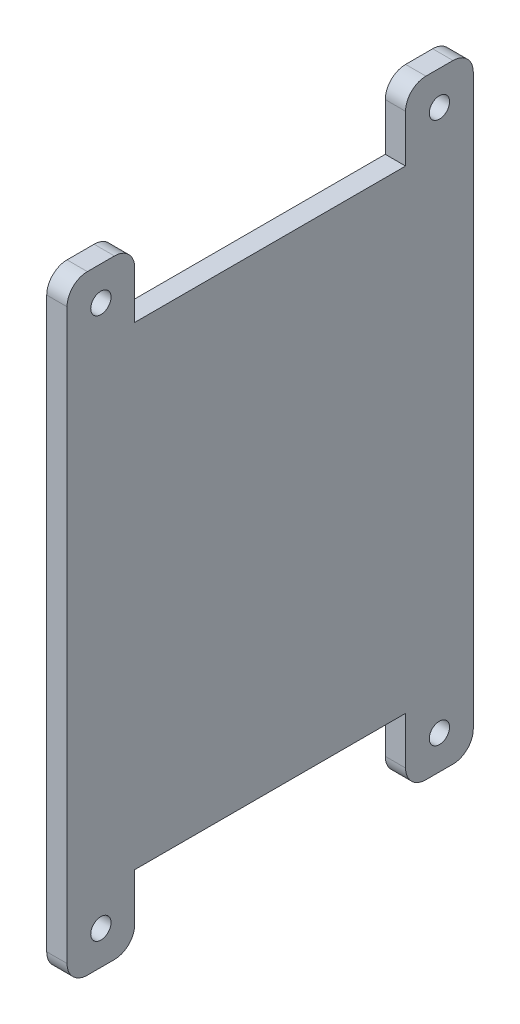
ISO-10303-21;
HEADER;
FILE_DESCRIPTION(('STEP AP214'),'2;1');
FILE_NAME('part.step','',(''),(''),'','','');
FILE_SCHEMA(('AUTOMOTIVE_DESIGN { 1 0 10303 214 1 1 1 1 }'));
ENDSEC;
DATA;
#1=APPLICATION_CONTEXT('core data for automotive mechanical design processes');
#2=APPLICATION_PROTOCOL_DEFINITION('international standard','automotive_design',2000,#1);
#3=PRODUCT_CONTEXT('',#1,'mechanical');
#4=PRODUCT('Part','Part','',(#3));
#5=PRODUCT_RELATED_PRODUCT_CATEGORY('part','',(#4));
#6=PRODUCT_DEFINITION_FORMATION('','',#4);
#7=PRODUCT_DEFINITION_CONTEXT('part definition',#1,'design');
#8=PRODUCT_DEFINITION('design','',#6,#7);
#9=PRODUCT_DEFINITION_SHAPE('','',#8);
#10=(LENGTH_UNIT() NAMED_UNIT(*) SI_UNIT(.MILLI.,.METRE.));
#11=(NAMED_UNIT(*) PLANE_ANGLE_UNIT() SI_UNIT($,.RADIAN.));
#12=(NAMED_UNIT(*) SI_UNIT($,.STERADIAN.) SOLID_ANGLE_UNIT());
#13=UNCERTAINTY_MEASURE_WITH_UNIT(LENGTH_MEASURE(1.E-05),#10,'distance_accuracy_value','');
#14=(GEOMETRIC_REPRESENTATION_CONTEXT(3) GLOBAL_UNCERTAINTY_ASSIGNED_CONTEXT((#13)) GLOBAL_UNIT_ASSIGNED_CONTEXT((#10,
#11,#12)) REPRESENTATION_CONTEXT('',''));
#15=CARTESIAN_POINT('',(0.,0.,0.));
#16=DIRECTION('',(0.,0.,1.));
#17=DIRECTION('',(1.,0.,0.));
#18=AXIS2_PLACEMENT_3D('',#15,#16,#17);
#19=CARTESIAN_POINT('',(3.,-47.3999085346622,11.8635274080616));
#20=DIRECTION('',(0.,0.,-1.));
#21=DIRECTION('',(-1.,0.,0.));
#22=AXIS2_PLACEMENT_3D('',#19,#20,#21);
#23=PLANE('',#22);
#24=DIRECTION('',(0.,-1.,0.));
#25=VECTOR('',#24,1.);
#26=CARTESIAN_POINT('',(0.,-47.3999085346622,11.8635274080616));
#27=LINE('',#26,#25);
#28=CARTESIAN_POINT('',(0.,29.6000914653378,11.8635274080616));
#29=VERTEX_POINT('',#28);
#30=CARTESIAN_POINT('',(0.,-54.3999085346622,11.8635274080616));
#31=VERTEX_POINT('',#30);
#32=EDGE_CURVE('E120',#29,#31,#27,.T.);
#33=ORIENTED_EDGE('',*,*,#32,.T.);
#34=DIRECTION('',(-1.,0.,0.));
#35=VECTOR('',#34,1.);
#36=CARTESIAN_POINT('',(3.,-54.3999085346622,11.8635274080616));
#37=LINE('',#36,#35);
#38=CARTESIAN_POINT('',(3.,-54.3999085346622,11.8635274080616));
#39=VERTEX_POINT('',#38);
#40=EDGE_CURVE('E11',#39,#31,#37,.T.);
#41=ORIENTED_EDGE('',*,*,#40,.F.);
#42=DIRECTION('',(0.,-1.,0.));
#43=VECTOR('',#42,1.);
#44=CARTESIAN_POINT('',(3.,22.6000914653378,11.8635274080616));
#45=LINE('',#44,#43);
#46=CARTESIAN_POINT('',(3.,29.6000914653378,11.8635274080616));
#47=VERTEX_POINT('',#46);
#48=EDGE_CURVE('E126',#47,#39,#45,.T.);
#49=ORIENTED_EDGE('',*,*,#48,.F.);
#50=DIRECTION('',(-1.,0.,0.));
#51=VECTOR('',#50,1.);
#52=CARTESIAN_POINT('',(3.,29.6000914653378,11.8635274080616));
#53=LINE('',#52,#51);
#54=EDGE_CURVE('E196',#47,#29,#53,.T.);
#55=ORIENTED_EDGE('',*,*,#54,.T.);
#56=EDGE_LOOP('',(#33,#41,#49,#55));
#57=FACE_BOUND('',#56,.T.);
#58=ADVANCED_FACE('F32',(#57),#23,.F.);
#59=CARTESIAN_POINT('',(3.,-54.3999085346622,8.86352740806162));
#60=DIRECTION('',(-1.,0.,0.));
#61=DIRECTION('',(0.,0.,1.));
#62=AXIS2_PLACEMENT_3D('',#59,#60,#61);
#63=CYLINDRICAL_SURFACE('',#62,3.);
#64=CARTESIAN_POINT('',(0.,-54.3999085346622,8.86352740806162));
#65=DIRECTION('',(1.,0.,0.));
#66=DIRECTION('',(0.,0.,-1.));
#67=AXIS2_PLACEMENT_3D('',#64,#65,#66);
#68=CIRCLE('',#67,3.);
#69=CARTESIAN_POINT('',(0.,-57.3999085346622,8.8635274080616));
#70=VERTEX_POINT('',#69);
#71=EDGE_CURVE('E201',#31,#70,#68,.T.);
#72=ORIENTED_EDGE('',*,*,#71,.T.);
#73=DIRECTION('',(-1.,0.,0.));
#74=VECTOR('',#73,1.);
#75=CARTESIAN_POINT('',(3.,-57.3999085346622,8.8635274080616));
#76=LINE('',#75,#74);
#77=CARTESIAN_POINT('',(3.,-57.3999085346622,8.8635274080616));
#78=VERTEX_POINT('',#77);
#79=EDGE_CURVE('E40',#78,#70,#76,.T.);
#80=ORIENTED_EDGE('',*,*,#79,.F.);
#81=CARTESIAN_POINT('',(3.,-54.3999085346622,8.86352740806162));
#82=DIRECTION('',(1.,0.,0.));
#83=DIRECTION('',(0.,0.,-1.));
#84=AXIS2_PLACEMENT_3D('',#81,#82,#83);
#85=CIRCLE('',#84,3.);
#86=EDGE_CURVE('E347',#39,#78,#85,.T.);
#87=ORIENTED_EDGE('',*,*,#86,.F.);
#88=ORIENTED_EDGE('',*,*,#40,.T.);
#89=EDGE_LOOP('',(#72,#80,#87,#88));
#90=FACE_BOUND('',#89,.T.);
#91=ADVANCED_FACE('F353',(#90),#63,.T.);
#92=CARTESIAN_POINT('',(3.,-57.3999085346622,8.8635274080616));
#93=DIRECTION('',(0.,1.,0.));
#94=DIRECTION('',(0.,0.,1.));
#95=AXIS2_PLACEMENT_3D('',#92,#93,#94);
#96=PLANE('',#95);
#97=DIRECTION('',(0.,0.,-1.));
#98=VECTOR('',#97,1.);
#99=CARTESIAN_POINT('',(0.,-57.3999085346622,8.8635274080616));
#100=LINE('',#99,#98);
#101=CARTESIAN_POINT('',(0.,-57.3999085346622,4.86352740806164));
#102=VERTEX_POINT('',#101);
#103=EDGE_CURVE('E204',#70,#102,#100,.T.);
#104=ORIENTED_EDGE('',*,*,#103,.T.);
#105=DIRECTION('',(-1.,0.,0.));
#106=VECTOR('',#105,1.);
#107=CARTESIAN_POINT('',(3.,-57.3999085346622,4.86352740806164));
#108=LINE('',#107,#106);
#109=CARTESIAN_POINT('',(3.,-57.3999085346622,4.86352740806164));
#110=VERTEX_POINT('',#109);
#111=EDGE_CURVE('E282',#110,#102,#108,.T.);
#112=ORIENTED_EDGE('',*,*,#111,.F.);
#113=DIRECTION('',(0.,0.,-1.));
#114=VECTOR('',#113,1.);
#115=CARTESIAN_POINT('',(3.,-57.3999085346622,8.8635274080616));
#116=LINE('',#115,#114);
#117=EDGE_CURVE('E291',#78,#110,#116,.T.);
#118=ORIENTED_EDGE('',*,*,#117,.F.);
#119=ORIENTED_EDGE('',*,*,#79,.T.);
#120=EDGE_LOOP('',(#104,#112,#118,#119));
#121=FACE_BOUND('',#120,.T.);
#122=ADVANCED_FACE('F289',(#121),#96,.F.);
#123=CARTESIAN_POINT('',(3.,-54.3999085346622,4.86352740806162));
#124=DIRECTION('',(-1.,0.,0.));
#125=DIRECTION('',(0.,0.,1.));
#126=AXIS2_PLACEMENT_3D('',#123,#124,#125);
#127=CYLINDRICAL_SURFACE('',#126,3.);
#128=CARTESIAN_POINT('',(0.,-54.3999085346622,4.86352740806162));
#129=DIRECTION('',(1.,0.,0.));
#130=DIRECTION('',(0.,0.,-1.));
#131=AXIS2_PLACEMENT_3D('',#128,#129,#130);
#132=CIRCLE('',#131,3.);
#133=CARTESIAN_POINT('',(0.,-54.3999085346622,1.86352740806162));
#134=VERTEX_POINT('',#133);
#135=EDGE_CURVE('E206',#102,#134,#132,.T.);
#136=ORIENTED_EDGE('',*,*,#135,.T.);
#137=DIRECTION('',(-1.,0.,0.));
#138=VECTOR('',#137,1.);
#139=CARTESIAN_POINT('',(3.,-54.3999085346622,1.86352740806162));
#140=LINE('',#139,#138);
#141=CARTESIAN_POINT('',(3.,-54.3999085346622,1.86352740806162));
#142=VERTEX_POINT('',#141);
#143=EDGE_CURVE('E279',#142,#134,#140,.T.);
#144=ORIENTED_EDGE('',*,*,#143,.F.);
#145=CARTESIAN_POINT('',(3.,-54.3999085346622,4.86352740806162));
#146=DIRECTION('',(1.,0.,0.));
#147=DIRECTION('',(0.,0.,-1.));
#148=AXIS2_PLACEMENT_3D('',#145,#146,#147);
#149=CIRCLE('',#148,3.);
#150=EDGE_CURVE('E309',#110,#142,#149,.T.);
#151=ORIENTED_EDGE('',*,*,#150,.F.);
#152=ORIENTED_EDGE('',*,*,#111,.T.);
#153=EDGE_LOOP('',(#136,#144,#151,#152));
#154=FACE_BOUND('',#153,.T.);
#155=ADVANCED_FACE('F300',(#154),#127,.T.);
#156=CARTESIAN_POINT('',(3.,-47.3999085346622,1.86352740806162));
#157=DIRECTION('',(0.,0.,1.));
#158=DIRECTION('',(0.,-1.,0.));
#159=AXIS2_PLACEMENT_3D('',#156,#157,#158);
#160=PLANE('',#159);
#161=DIRECTION('',(0.,1.,0.));
#162=VECTOR('',#161,1.);
#163=CARTESIAN_POINT('',(0.,-47.3999085346622,1.86352740806162));
#164=LINE('',#163,#162);
#165=CARTESIAN_POINT('',(0.,-47.3999085346622,1.86352740806162));
#166=VERTEX_POINT('',#165);
#167=EDGE_CURVE('E208',#134,#166,#164,.T.);
#168=ORIENTED_EDGE('',*,*,#167,.T.);
#169=DIRECTION('',(-1.,0.,0.));
#170=VECTOR('',#169,1.);
#171=CARTESIAN_POINT('',(3.,-47.3999085346622,1.86352740806162));
#172=LINE('',#171,#170);
#173=CARTESIAN_POINT('',(3.,-47.3999085346622,1.86352740806162));
#174=VERTEX_POINT('',#173);
#175=EDGE_CURVE('E276',#174,#166,#172,.T.);
#176=ORIENTED_EDGE('',*,*,#175,.F.);
#177=DIRECTION('',(0.,1.,0.));
#178=VECTOR('',#177,1.);
#179=CARTESIAN_POINT('',(3.,-47.3999085346622,1.86352740806162));
#180=LINE('',#179,#178);
#181=EDGE_CURVE('E306',#142,#174,#180,.T.);
#182=ORIENTED_EDGE('',*,*,#181,.F.);
#183=ORIENTED_EDGE('',*,*,#143,.T.);
#184=EDGE_LOOP('',(#168,#176,#182,#183));
#185=FACE_BOUND('',#184,.T.);
#186=ADVANCED_FACE('F304',(#185),#160,.F.);
#187=CARTESIAN_POINT('',(3.,-47.3999085346622,1.86352740806162));
#188=DIRECTION('',(0.,1.,0.));
#189=DIRECTION('',(0.,0.,1.));
#190=AXIS2_PLACEMENT_3D('',#187,#188,#189);
#191=PLANE('',#190);
#192=DIRECTION('',(0.,0.,-1.));
#193=VECTOR('',#192,1.);
#194=CARTESIAN_POINT('',(0.,-47.3999085346622,1.86352740806162));
#195=LINE('',#194,#193);
#196=CARTESIAN_POINT('',(0.,-47.3999085346622,-38.1364725919384));
#197=VERTEX_POINT('',#196);
#198=EDGE_CURVE('E210',#166,#197,#195,.T.);
#199=ORIENTED_EDGE('',*,*,#198,.T.);
#200=DIRECTION('',(-1.,0.,0.));
#201=VECTOR('',#200,1.);
#202=CARTESIAN_POINT('',(3.,-47.3999085346622,-38.1364725919384));
#203=LINE('',#202,#201);
#204=CARTESIAN_POINT('',(3.,-47.3999085346622,-38.1364725919384));
#205=VERTEX_POINT('',#204);
#206=EDGE_CURVE('E273',#205,#197,#203,.T.);
#207=ORIENTED_EDGE('',*,*,#206,.F.);
#208=DIRECTION('',(0.,0.,-1.));
#209=VECTOR('',#208,1.);
#210=CARTESIAN_POINT('',(3.,-47.3999085346622,1.86352740806162));
#211=LINE('',#210,#209);
#212=EDGE_CURVE('E308',#174,#205,#211,.T.);
#213=ORIENTED_EDGE('',*,*,#212,.F.);
#214=ORIENTED_EDGE('',*,*,#175,.T.);
#215=EDGE_LOOP('',(#199,#207,#213,#214));
#216=FACE_BOUND('',#215,.T.);
#217=ADVANCED_FACE('F365',(#216),#191,.F.);
#218=CARTESIAN_POINT('',(3.,-47.3999085346622,-38.1364725919384));
#219=DIRECTION('',(0.,0.,-1.));
#220=DIRECTION('',(0.,1.,0.));
#221=AXIS2_PLACEMENT_3D('',#218,#219,#220);
#222=PLANE('',#221);
#223=DIRECTION('',(0.,-1.,0.));
#224=VECTOR('',#223,1.);
#225=CARTESIAN_POINT('',(0.,-47.3999085346622,-38.1364725919384));
#226=LINE('',#225,#224);
#227=CARTESIAN_POINT('',(0.,-54.3999085346622,-38.1364725919384));
#228=VERTEX_POINT('',#227);
#229=EDGE_CURVE('E212',#197,#228,#226,.T.);
#230=ORIENTED_EDGE('',*,*,#229,.T.);
#231=DIRECTION('',(-1.,0.,0.));
#232=VECTOR('',#231,1.);
#233=CARTESIAN_POINT('',(3.,-54.3999085346622,-38.1364725919384));
#234=LINE('',#233,#232);
#235=CARTESIAN_POINT('',(3.,-54.3999085346622,-38.1364725919384));
#236=VERTEX_POINT('',#235);
#237=EDGE_CURVE('E270',#236,#228,#234,.T.);
#238=ORIENTED_EDGE('',*,*,#237,.F.);
#239=DIRECTION('',(0.,-1.,0.));
#240=VECTOR('',#239,1.);
#241=CARTESIAN_POINT('',(3.,-47.3999085346622,-38.1364725919384));
#242=LINE('',#241,#240);
#243=EDGE_CURVE('E311',#205,#236,#242,.T.);
#244=ORIENTED_EDGE('',*,*,#243,.F.);
#245=ORIENTED_EDGE('',*,*,#206,.T.);
#246=EDGE_LOOP('',(#230,#238,#244,#245));
#247=FACE_BOUND('',#246,.T.);
#248=ADVANCED_FACE('F368',(#247),#222,.F.);
#249=CARTESIAN_POINT('',(3.,-54.3999085346622,-41.1364725919384));
#250=DIRECTION('',(-1.,0.,0.));
#251=DIRECTION('',(0.,0.,1.));
#252=AXIS2_PLACEMENT_3D('',#249,#250,#251);
#253=CYLINDRICAL_SURFACE('',#252,3.);
#254=CARTESIAN_POINT('',(0.,-54.3999085346622,-41.1364725919384));
#255=DIRECTION('',(1.,0.,0.));
#256=DIRECTION('',(0.,0.,1.));
#257=AXIS2_PLACEMENT_3D('',#254,#255,#256);
#258=CIRCLE('',#257,3.);
#259=CARTESIAN_POINT('',(0.,-57.3999085346622,-41.1364725919384));
#260=VERTEX_POINT('',#259);
#261=EDGE_CURVE('E214',#228,#260,#258,.T.);
#262=ORIENTED_EDGE('',*,*,#261,.T.);
#263=DIRECTION('',(-1.,0.,0.));
#264=VECTOR('',#263,1.);
#265=CARTESIAN_POINT('',(3.,-57.3999085346622,-41.1364725919384));
#266=LINE('',#265,#264);
#267=CARTESIAN_POINT('',(3.,-57.3999085346622,-41.1364725919384));
#268=VERTEX_POINT('',#267);
#269=EDGE_CURVE('E267',#268,#260,#266,.T.);
#270=ORIENTED_EDGE('',*,*,#269,.F.);
#271=CARTESIAN_POINT('',(3.,-54.3999085346622,-41.1364725919384));
#272=DIRECTION('',(1.,0.,0.));
#273=DIRECTION('',(0.,0.,1.));
#274=AXIS2_PLACEMENT_3D('',#271,#272,#273);
#275=CIRCLE('',#274,3.);
#276=EDGE_CURVE('E317',#236,#268,#275,.T.);
#277=ORIENTED_EDGE('',*,*,#276,.F.);
#278=ORIENTED_EDGE('',*,*,#237,.T.);
#279=EDGE_LOOP('',(#262,#270,#277,#278));
#280=FACE_BOUND('',#279,.T.);
#281=ADVANCED_FACE('F372',(#280),#253,.T.);
#282=CARTESIAN_POINT('',(3.,-57.3999085346622,-45.1364725919384));
#283=DIRECTION('',(0.,1.,0.));
#284=DIRECTION('',(0.,0.,1.));
#285=AXIS2_PLACEMENT_3D('',#282,#283,#284);
#286=PLANE('',#285);
#287=DIRECTION('',(0.,0.,-1.));
#288=VECTOR('',#287,1.);
#289=CARTESIAN_POINT('',(0.,-57.3999085346622,-45.1364725919384));
#290=LINE('',#289,#288);
#291=CARTESIAN_POINT('',(0.,-57.3999085346622,-45.1364725919384));
#292=VERTEX_POINT('',#291);
#293=EDGE_CURVE('E216',#260,#292,#290,.T.);
#294=ORIENTED_EDGE('',*,*,#293,.T.);
#295=DIRECTION('',(-1.,0.,0.));
#296=VECTOR('',#295,1.);
#297=CARTESIAN_POINT('',(3.,-57.3999085346622,-45.1364725919384));
#298=LINE('',#297,#296);
#299=CARTESIAN_POINT('',(3.,-57.3999085346622,-45.1364725919384));
#300=VERTEX_POINT('',#299);
#301=EDGE_CURVE('E264',#300,#292,#298,.T.);
#302=ORIENTED_EDGE('',*,*,#301,.F.);
#303=DIRECTION('',(0.,0.,-1.));
#304=VECTOR('',#303,1.);
#305=CARTESIAN_POINT('',(3.,-57.3999085346622,-45.1364725919384));
#306=LINE('',#305,#304);
#307=EDGE_CURVE('E319',#268,#300,#306,.T.);
#308=ORIENTED_EDGE('',*,*,#307,.F.);
#309=ORIENTED_EDGE('',*,*,#269,.T.);
#310=EDGE_LOOP('',(#294,#302,#308,#309));
#311=FACE_BOUND('',#310,.T.);
#312=ADVANCED_FACE('F376',(#311),#286,.F.);
#313=CARTESIAN_POINT('',(3.,-54.3999085346622,-45.1364725919384));
#314=DIRECTION('',(-1.,0.,0.));
#315=DIRECTION('',(0.,0.,1.));
#316=AXIS2_PLACEMENT_3D('',#313,#314,#315);
#317=CYLINDRICAL_SURFACE('',#316,3.);
#318=CARTESIAN_POINT('',(0.,-54.3999085346622,-45.1364725919384));
#319=DIRECTION('',(1.,0.,0.));
#320=DIRECTION('',(0.,0.,1.));
#321=AXIS2_PLACEMENT_3D('',#318,#319,#320);
#322=CIRCLE('',#321,3.);
#323=CARTESIAN_POINT('',(0.,-54.3999085346622,-48.1364725919384));
#324=VERTEX_POINT('',#323);
#325=EDGE_CURVE('E218',#292,#324,#322,.T.);
#326=ORIENTED_EDGE('',*,*,#325,.T.);
#327=DIRECTION('',(-1.,0.,0.));
#328=VECTOR('',#327,1.);
#329=CARTESIAN_POINT('',(3.,-54.3999085346622,-48.1364725919384));
#330=LINE('',#329,#328);
#331=CARTESIAN_POINT('',(3.,-54.3999085346622,-48.1364725919384));
#332=VERTEX_POINT('',#331);
#333=EDGE_CURVE('E261',#332,#324,#330,.T.);
#334=ORIENTED_EDGE('',*,*,#333,.F.);
#335=CARTESIAN_POINT('',(3.,-54.3999085346622,-45.1364725919384));
#336=DIRECTION('',(1.,0.,0.));
#337=DIRECTION('',(0.,0.,1.));
#338=AXIS2_PLACEMENT_3D('',#335,#336,#337);
#339=CIRCLE('',#338,3.);
#340=EDGE_CURVE('E321',#300,#332,#339,.T.);
#341=ORIENTED_EDGE('',*,*,#340,.F.);
#342=ORIENTED_EDGE('',*,*,#301,.T.);
#343=EDGE_LOOP('',(#326,#334,#341,#342));
#344=FACE_BOUND('',#343,.T.);
#345=ADVANCED_FACE('F380',(#344),#317,.T.);
#346=CARTESIAN_POINT('',(3.,22.6000914653378,-48.1364725919384));
#347=DIRECTION('',(0.,0.,1.));
#348=DIRECTION('',(1.,0.,0.));
#349=AXIS2_PLACEMENT_3D('',#346,#347,#348);
#350=PLANE('',#349);
#351=DIRECTION('',(0.,1.,0.));
#352=VECTOR('',#351,1.);
#353=CARTESIAN_POINT('',(0.,22.6000914653378,-48.1364725919384));
#354=LINE('',#353,#352);
#355=CARTESIAN_POINT('',(0.,29.6000914653378,-48.1364725919384));
#356=VERTEX_POINT('',#355);
#357=EDGE_CURVE('E221',#324,#356,#354,.T.);
#358=ORIENTED_EDGE('',*,*,#357,.T.);
#359=DIRECTION('',(-1.,0.,0.));
#360=VECTOR('',#359,1.);
#361=CARTESIAN_POINT('',(3.,29.6000914653378,-48.1364725919384));
#362=LINE('',#361,#360);
#363=CARTESIAN_POINT('',(3.,29.6000914653378,-48.1364725919384));
#364=VERTEX_POINT('',#363);
#365=EDGE_CURVE('E258',#364,#356,#362,.T.);
#366=ORIENTED_EDGE('',*,*,#365,.F.);
#367=DIRECTION('',(0.,1.,0.));
#368=VECTOR('',#367,1.);
#369=CARTESIAN_POINT('',(3.,-47.3999085346622,-48.1364725919384));
#370=LINE('',#369,#368);
#371=EDGE_CURVE('E323',#332,#364,#370,.T.);
#372=ORIENTED_EDGE('',*,*,#371,.F.);
#373=ORIENTED_EDGE('',*,*,#333,.T.);
#374=EDGE_LOOP('',(#358,#366,#372,#373));
#375=FACE_BOUND('',#374,.T.);
#376=ADVANCED_FACE('F384',(#375),#350,.F.);
#377=CARTESIAN_POINT('',(3.,29.6000914653378,-45.1364725919384));
#378=DIRECTION('',(-1.,0.,0.));
#379=DIRECTION('',(0.,0.,1.));
#380=AXIS2_PLACEMENT_3D('',#377,#378,#379);
#381=CYLINDRICAL_SURFACE('',#380,3.);
#382=CARTESIAN_POINT('',(0.,29.6000914653378,-45.1364725919384));
#383=DIRECTION('',(1.,0.,0.));
#384=DIRECTION('',(0.,0.,-1.));
#385=AXIS2_PLACEMENT_3D('',#382,#383,#384);
#386=CIRCLE('',#385,3.);
#387=CARTESIAN_POINT('',(0.,32.6000914653378,-45.1364725919383));
#388=VERTEX_POINT('',#387);
#389=EDGE_CURVE('E223',#356,#388,#386,.T.);
#390=ORIENTED_EDGE('',*,*,#389,.T.);
#391=DIRECTION('',(-1.,0.,0.));
#392=VECTOR('',#391,1.);
#393=CARTESIAN_POINT('',(3.,32.6000914653378,-45.1364725919383));
#394=LINE('',#393,#392);
#395=CARTESIAN_POINT('',(3.,32.6000914653378,-45.1364725919383));
#396=VERTEX_POINT('',#395);
#397=EDGE_CURVE('E255',#396,#388,#394,.T.);
#398=ORIENTED_EDGE('',*,*,#397,.F.);
#399=CARTESIAN_POINT('',(3.,29.6000914653378,-45.1364725919384));
#400=DIRECTION('',(1.,0.,0.));
#401=DIRECTION('',(0.,0.,-1.));
#402=AXIS2_PLACEMENT_3D('',#399,#400,#401);
#403=CIRCLE('',#402,3.);
#404=EDGE_CURVE('E325',#364,#396,#403,.T.);
#405=ORIENTED_EDGE('',*,*,#404,.F.);
#406=ORIENTED_EDGE('',*,*,#365,.T.);
#407=EDGE_LOOP('',(#390,#398,#405,#406));
#408=FACE_BOUND('',#407,.T.);
#409=ADVANCED_FACE('F388',(#408),#381,.T.);
#410=CARTESIAN_POINT('',(3.,32.6000914653378,-45.1364725919383));
#411=DIRECTION('',(0.,-1.,0.));
#412=DIRECTION('',(0.,0.,-1.));
#413=AXIS2_PLACEMENT_3D('',#410,#411,#412);
#414=PLANE('',#413);
#415=DIRECTION('',(0.,0.,1.));
#416=VECTOR('',#415,1.);
#417=CARTESIAN_POINT('',(0.,32.6000914653378,-45.1364725919383));
#418=LINE('',#417,#416);
#419=CARTESIAN_POINT('',(0.,32.6000914653378,-41.1364725919384));
#420=VERTEX_POINT('',#419);
#421=EDGE_CURVE('E225',#388,#420,#418,.T.);
#422=ORIENTED_EDGE('',*,*,#421,.T.);
#423=DIRECTION('',(-1.,0.,0.));
#424=VECTOR('',#423,1.);
#425=CARTESIAN_POINT('',(3.,32.6000914653378,-41.1364725919384));
#426=LINE('',#425,#424);
#427=CARTESIAN_POINT('',(3.,32.6000914653378,-41.1364725919384));
#428=VERTEX_POINT('',#427);
#429=EDGE_CURVE('E252',#428,#420,#426,.T.);
#430=ORIENTED_EDGE('',*,*,#429,.F.);
#431=DIRECTION('',(0.,0.,1.));
#432=VECTOR('',#431,1.);
#433=CARTESIAN_POINT('',(3.,32.6000914653378,-45.1364725919383));
#434=LINE('',#433,#432);
#435=EDGE_CURVE('E327',#396,#428,#434,.T.);
#436=ORIENTED_EDGE('',*,*,#435,.F.);
#437=ORIENTED_EDGE('',*,*,#397,.T.);
#438=EDGE_LOOP('',(#422,#430,#436,#437));
#439=FACE_BOUND('',#438,.T.);
#440=ADVANCED_FACE('F392',(#439),#414,.F.);
#441=CARTESIAN_POINT('',(3.,29.6000914653378,-41.1364725919384));
#442=DIRECTION('',(-1.,0.,0.));
#443=DIRECTION('',(0.,0.,1.));
#444=AXIS2_PLACEMENT_3D('',#441,#442,#443);
#445=CYLINDRICAL_SURFACE('',#444,3.);
#446=CARTESIAN_POINT('',(0.,29.6000914653378,-41.1364725919384));
#447=DIRECTION('',(1.,0.,0.));
#448=DIRECTION('',(0.,0.,-1.));
#449=AXIS2_PLACEMENT_3D('',#446,#447,#448);
#450=CIRCLE('',#449,3.);
#451=CARTESIAN_POINT('',(0.,29.6000914653378,-38.1364725919384));
#452=VERTEX_POINT('',#451);
#453=EDGE_CURVE('E227',#420,#452,#450,.T.);
#454=ORIENTED_EDGE('',*,*,#453,.T.);
#455=DIRECTION('',(-1.,0.,0.));
#456=VECTOR('',#455,1.);
#457=CARTESIAN_POINT('',(3.,29.6000914653378,-38.1364725919384));
#458=LINE('',#457,#456);
#459=CARTESIAN_POINT('',(3.,29.6000914653378,-38.1364725919384));
#460=VERTEX_POINT('',#459);
#461=EDGE_CURVE('E249',#460,#452,#458,.T.);
#462=ORIENTED_EDGE('',*,*,#461,.F.);
#463=CARTESIAN_POINT('',(3.,29.6000914653378,-41.1364725919384));
#464=DIRECTION('',(1.,0.,0.));
#465=DIRECTION('',(0.,0.,-1.));
#466=AXIS2_PLACEMENT_3D('',#463,#464,#465);
#467=CIRCLE('',#466,3.);
#468=EDGE_CURVE('E329',#428,#460,#467,.T.);
#469=ORIENTED_EDGE('',*,*,#468,.F.);
#470=ORIENTED_EDGE('',*,*,#429,.T.);
#471=EDGE_LOOP('',(#454,#462,#469,#470));
#472=FACE_BOUND('',#471,.T.);
#473=ADVANCED_FACE('F396',(#472),#445,.T.);
#474=CARTESIAN_POINT('',(3.,22.6000914653378,-38.1364725919384));
#475=DIRECTION('',(0.,0.,-1.));
#476=DIRECTION('',(-1.,0.,0.));
#477=AXIS2_PLACEMENT_3D('',#474,#475,#476);
#478=PLANE('',#477);
#479=DIRECTION('',(0.,-1.,0.));
#480=VECTOR('',#479,1.);
#481=CARTESIAN_POINT('',(0.,22.6000914653378,-38.1364725919384));
#482=LINE('',#481,#480);
#483=CARTESIAN_POINT('',(0.,22.6000914653378,-38.1364725919384));
#484=VERTEX_POINT('',#483);
#485=EDGE_CURVE('E229',#452,#484,#482,.T.);
#486=ORIENTED_EDGE('',*,*,#485,.T.);
#487=DIRECTION('',(-1.,0.,0.));
#488=VECTOR('',#487,1.);
#489=CARTESIAN_POINT('',(3.,22.6000914653378,-38.1364725919384));
#490=LINE('',#489,#488);
#491=CARTESIAN_POINT('',(3.,22.6000914653378,-38.1364725919384));
#492=VERTEX_POINT('',#491);
#493=EDGE_CURVE('E246',#492,#484,#490,.T.);
#494=ORIENTED_EDGE('',*,*,#493,.F.);
#495=DIRECTION('',(0.,-1.,0.));
#496=VECTOR('',#495,1.);
#497=CARTESIAN_POINT('',(3.,22.6000914653378,-38.1364725919384));
#498=LINE('',#497,#496);
#499=EDGE_CURVE('E331',#460,#492,#498,.T.);
#500=ORIENTED_EDGE('',*,*,#499,.F.);
#501=ORIENTED_EDGE('',*,*,#461,.T.);
#502=EDGE_LOOP('',(#486,#494,#500,#501));
#503=FACE_BOUND('',#502,.T.);
#504=ADVANCED_FACE('F400',(#503),#478,.F.);
#505=CARTESIAN_POINT('',(3.,22.6000914653378,1.86352740806163));
#506=DIRECTION('',(0.,-1.,0.));
#507=DIRECTION('',(0.,0.,-1.));
#508=AXIS2_PLACEMENT_3D('',#505,#506,#507);
#509=PLANE('',#508);
#510=DIRECTION('',(0.,0.,1.));
#511=VECTOR('',#510,1.);
#512=CARTESIAN_POINT('',(0.,22.6000914653378,1.86352740806163));
#513=LINE('',#512,#511);
#514=CARTESIAN_POINT('',(0.,22.6000914653378,1.86352740806163));
#515=VERTEX_POINT('',#514);
#516=EDGE_CURVE('E231',#484,#515,#513,.T.);
#517=ORIENTED_EDGE('',*,*,#516,.T.);
#518=DIRECTION('',(-1.,0.,0.));
#519=VECTOR('',#518,1.);
#520=CARTESIAN_POINT('',(3.,22.6000914653378,1.86352740806163));
#521=LINE('',#520,#519);
#522=CARTESIAN_POINT('',(3.,22.6000914653378,1.86352740806163));
#523=VERTEX_POINT('',#522);
#524=EDGE_CURVE('E243',#523,#515,#521,.T.);
#525=ORIENTED_EDGE('',*,*,#524,.F.);
#526=DIRECTION('',(0.,0.,1.));
#527=VECTOR('',#526,1.);
#528=CARTESIAN_POINT('',(3.,22.6000914653378,1.86352740806163));
#529=LINE('',#528,#527);
#530=EDGE_CURVE('E333',#492,#523,#529,.T.);
#531=ORIENTED_EDGE('',*,*,#530,.F.);
#532=ORIENTED_EDGE('',*,*,#493,.T.);
#533=EDGE_LOOP('',(#517,#525,#531,#532));
#534=FACE_BOUND('',#533,.T.);
#535=ADVANCED_FACE('F339',(#534),#509,.F.);
#536=CARTESIAN_POINT('',(3.,22.6000914653378,1.86352740806163));
#537=DIRECTION('',(0.,0.,1.));
#538=DIRECTION('',(0.,-1.,0.));
#539=AXIS2_PLACEMENT_3D('',#536,#537,#538);
#540=PLANE('',#539);
#541=DIRECTION('',(0.,1.,0.));
#542=VECTOR('',#541,1.);
#543=CARTESIAN_POINT('',(0.,22.6000914653378,1.86352740806163));
#544=LINE('',#543,#542);
#545=CARTESIAN_POINT('',(0.,29.6000914653378,1.86352740806163));
#546=VERTEX_POINT('',#545);
#547=EDGE_CURVE('E233',#515,#546,#544,.T.);
#548=ORIENTED_EDGE('',*,*,#547,.T.);
#549=DIRECTION('',(-1.,0.,0.));
#550=VECTOR('',#549,1.);
#551=CARTESIAN_POINT('',(3.,29.6000914653378,1.86352740806163));
#552=LINE('',#551,#550);
#553=CARTESIAN_POINT('',(3.,29.6000914653378,1.86352740806163));
#554=VERTEX_POINT('',#553);
#555=EDGE_CURVE('E191',#554,#546,#552,.T.);
#556=ORIENTED_EDGE('',*,*,#555,.F.);
#557=DIRECTION('',(0.,1.,0.));
#558=VECTOR('',#557,1.);
#559=CARTESIAN_POINT('',(3.,22.6000914653378,1.86352740806163));
#560=LINE('',#559,#558);
#561=EDGE_CURVE('E182',#523,#554,#560,.T.);
#562=ORIENTED_EDGE('',*,*,#561,.F.);
#563=ORIENTED_EDGE('',*,*,#524,.T.);
#564=EDGE_LOOP('',(#548,#556,#562,#563));
#565=FACE_BOUND('',#564,.T.);
#566=ADVANCED_FACE('F343',(#565),#540,.F.);
#567=CARTESIAN_POINT('',(3.,29.6000914653378,4.86352740806163));
#568=DIRECTION('',(-1.,0.,0.));
#569=DIRECTION('',(0.,0.,1.));
#570=AXIS2_PLACEMENT_3D('',#567,#568,#569);
#571=CYLINDRICAL_SURFACE('',#570,3.);
#572=CARTESIAN_POINT('',(0.,29.6000914653378,4.86352740806163));
#573=DIRECTION('',(1.,0.,0.));
#574=DIRECTION('',(0.,0.,1.));
#575=AXIS2_PLACEMENT_3D('',#572,#573,#574);
#576=CIRCLE('',#575,3.);
#577=CARTESIAN_POINT('',(0.,32.6000914653378,4.86352740806165));
#578=VERTEX_POINT('',#577);
#579=EDGE_CURVE('E190',#546,#578,#576,.T.);
#580=ORIENTED_EDGE('',*,*,#579,.T.);
#581=DIRECTION('',(-1.,0.,0.));
#582=VECTOR('',#581,1.);
#583=CARTESIAN_POINT('',(3.,32.6000914653378,4.86352740806165));
#584=LINE('',#583,#582);
#585=CARTESIAN_POINT('',(3.,32.6000914653378,4.86352740806165));
#586=VERTEX_POINT('',#585);
#587=EDGE_CURVE('E187',#586,#578,#584,.T.);
#588=ORIENTED_EDGE('',*,*,#587,.F.);
#589=CARTESIAN_POINT('',(3.,29.6000914653378,4.86352740806163));
#590=DIRECTION('',(1.,0.,0.));
#591=DIRECTION('',(0.,0.,1.));
#592=AXIS2_PLACEMENT_3D('',#589,#590,#591);
#593=CIRCLE('',#592,3.);
#594=EDGE_CURVE('E176',#554,#586,#593,.T.);
#595=ORIENTED_EDGE('',*,*,#594,.F.);
#596=ORIENTED_EDGE('',*,*,#555,.T.);
#597=EDGE_LOOP('',(#580,#588,#595,#596));
#598=FACE_BOUND('',#597,.T.);
#599=ADVANCED_FACE('F188',(#598),#571,.T.);
#600=CARTESIAN_POINT('',(3.,32.6000914653378,8.86352740806161));
#601=DIRECTION('',(0.,-1.,0.));
#602=DIRECTION('',(0.,0.,-1.));
#603=AXIS2_PLACEMENT_3D('',#600,#601,#602);
#604=PLANE('',#603);
#605=DIRECTION('',(0.,0.,1.));
#606=VECTOR('',#605,1.);
#607=CARTESIAN_POINT('',(0.,32.6000914653378,8.86352740806161));
#608=LINE('',#607,#606);
#609=CARTESIAN_POINT('',(0.,32.6000914653378,8.86352740806161));
#610=VERTEX_POINT('',#609);
#611=EDGE_CURVE('E113',#578,#610,#608,.T.);
#612=ORIENTED_EDGE('',*,*,#611,.T.);
#613=DIRECTION('',(-1.,0.,0.));
#614=VECTOR('',#613,1.);
#615=CARTESIAN_POINT('',(3.,32.6000914653378,8.86352740806161));
#616=LINE('',#615,#614);
#617=CARTESIAN_POINT('',(3.,32.6000914653378,8.86352740806161));
#618=VERTEX_POINT('',#617);
#619=EDGE_CURVE('E192',#618,#610,#616,.T.);
#620=ORIENTED_EDGE('',*,*,#619,.F.);
#621=DIRECTION('',(0.,0.,1.));
#622=VECTOR('',#621,1.);
#623=CARTESIAN_POINT('',(3.,32.6000914653378,8.86352740806161));
#624=LINE('',#623,#622);
#625=EDGE_CURVE('E180',#586,#618,#624,.T.);
#626=ORIENTED_EDGE('',*,*,#625,.F.);
#627=ORIENTED_EDGE('',*,*,#587,.T.);
#628=EDGE_LOOP('',(#612,#620,#626,#627));
#629=FACE_BOUND('',#628,.T.);
#630=ADVANCED_FACE('F194',(#629),#604,.F.);
#631=CARTESIAN_POINT('',(3.,29.6000914653378,8.86352740806162));
#632=DIRECTION('',(-1.,0.,0.));
#633=DIRECTION('',(0.,0.,1.));
#634=AXIS2_PLACEMENT_3D('',#631,#632,#633);
#635=CYLINDRICAL_SURFACE('',#634,3.);
#636=CARTESIAN_POINT('',(0.,29.6000914653378,8.86352740806162));
#637=DIRECTION('',(1.,0.,0.));
#638=DIRECTION('',(0.,0.,1.));
#639=AXIS2_PLACEMENT_3D('',#636,#637,#638);
#640=CIRCLE('',#639,3.);
#641=EDGE_CURVE('E237',#610,#29,#640,.T.);
#642=ORIENTED_EDGE('',*,*,#641,.T.);
#643=ORIENTED_EDGE('',*,*,#54,.F.);
#644=CARTESIAN_POINT('',(3.,29.6000914653378,8.86352740806162));
#645=DIRECTION('',(1.,0.,0.));
#646=DIRECTION('',(0.,0.,1.));
#647=AXIS2_PLACEMENT_3D('',#644,#645,#646);
#648=CIRCLE('',#647,3.);
#649=EDGE_CURVE('E48',#618,#47,#648,.T.);
#650=ORIENTED_EDGE('',*,*,#649,.F.);
#651=ORIENTED_EDGE('',*,*,#619,.T.);
#652=EDGE_LOOP('',(#642,#643,#650,#651));
#653=FACE_BOUND('',#652,.T.);
#654=ADVANCED_FACE('F345',(#653),#635,.T.);
#655=CARTESIAN_POINT('',(3.,29.6000914653378,8.86352740806162));
#656=DIRECTION('',(-1.,0.,0.));
#657=DIRECTION('',(0.,0.,1.));
#658=AXIS2_PLACEMENT_3D('',#655,#656,#657);
#659=PLANE('',#658);
#660=CARTESIAN_POINT('',(3.,27.6000914653378,6.86352740806162));
#661=DIRECTION('',(-1.,0.,0.));
#662=DIRECTION('',(0.,0.,1.));
#663=AXIS2_PLACEMENT_3D('',#660,#661,#662);
#664=CIRCLE('',#663,1.5);
#665=CARTESIAN_POINT('',(3.,27.6000914653378,8.36352740806162));
#666=VERTEX_POINT('',#665);
#667=EDGE_CURVE('E441',#666,#666,#664,.T.);
#668=ORIENTED_EDGE('',*,*,#667,.T.);
#669=EDGE_LOOP('',(#668));
#670=FACE_BOUND('',#669,.T.);
#671=CARTESIAN_POINT('',(3.,-52.3999085346622,6.86352740806162));
#672=DIRECTION('',(-1.,0.,0.));
#673=DIRECTION('',(0.,0.,1.));
#674=AXIS2_PLACEMENT_3D('',#671,#672,#673);
#675=CIRCLE('',#674,1.5);
#676=CARTESIAN_POINT('',(3.,-52.3999085346622,8.36352740806162));
#677=VERTEX_POINT('',#676);
#678=EDGE_CURVE('E445',#677,#677,#675,.T.);
#679=ORIENTED_EDGE('',*,*,#678,.T.);
#680=EDGE_LOOP('',(#679));
#681=FACE_BOUND('',#680,.T.);
#682=CARTESIAN_POINT('',(3.,-52.3999085346622,-43.1364725919384));
#683=DIRECTION('',(-1.,0.,0.));
#684=DIRECTION('',(0.,0.,1.));
#685=AXIS2_PLACEMENT_3D('',#682,#683,#684);
#686=CIRCLE('',#685,1.5);
#687=CARTESIAN_POINT('',(3.,-52.3999085346622,-41.6364725919384));
#688=VERTEX_POINT('',#687);
#689=EDGE_CURVE('E454',#688,#688,#686,.T.);
#690=ORIENTED_EDGE('',*,*,#689,.T.);
#691=EDGE_LOOP('',(#690));
#692=FACE_BOUND('',#691,.T.);
#693=CARTESIAN_POINT('',(3.,27.6000914653378,-43.1364725919384));
#694=DIRECTION('',(-1.,0.,0.));
#695=DIRECTION('',(0.,0.,1.));
#696=AXIS2_PLACEMENT_3D('',#693,#694,#695);
#697=CIRCLE('',#696,1.5);
#698=CARTESIAN_POINT('',(3.,27.6000914653378,-41.6364725919384));
#699=VERTEX_POINT('',#698);
#700=EDGE_CURVE('E202',#699,#699,#697,.T.);
#701=ORIENTED_EDGE('',*,*,#700,.T.);
#702=EDGE_LOOP('',(#701));
#703=FACE_BOUND('',#702,.T.);
#704=ORIENTED_EDGE('',*,*,#48,.T.);
#705=ORIENTED_EDGE('',*,*,#86,.T.);
#706=ORIENTED_EDGE('',*,*,#117,.T.);
#707=ORIENTED_EDGE('',*,*,#150,.T.);
#708=ORIENTED_EDGE('',*,*,#181,.T.);
#709=ORIENTED_EDGE('',*,*,#212,.T.);
#710=ORIENTED_EDGE('',*,*,#243,.T.);
#711=ORIENTED_EDGE('',*,*,#276,.T.);
#712=ORIENTED_EDGE('',*,*,#307,.T.);
#713=ORIENTED_EDGE('',*,*,#340,.T.);
#714=ORIENTED_EDGE('',*,*,#371,.T.);
#715=ORIENTED_EDGE('',*,*,#404,.T.);
#716=ORIENTED_EDGE('',*,*,#435,.T.);
#717=ORIENTED_EDGE('',*,*,#468,.T.);
#718=ORIENTED_EDGE('',*,*,#499,.T.);
#719=ORIENTED_EDGE('',*,*,#530,.T.);
#720=ORIENTED_EDGE('',*,*,#561,.T.);
#721=ORIENTED_EDGE('',*,*,#594,.T.);
#722=ORIENTED_EDGE('',*,*,#625,.T.);
#723=ORIENTED_EDGE('',*,*,#649,.T.);
#724=EDGE_LOOP('',(#704,#705,#706,#707,#708,#709,#710,#711,#712,#713,#714,#715,#716,#717,#718,
#719,#720,#721,#722,#723));
#725=FACE_BOUND('',#724,.T.);
#726=ADVANCED_FACE('F178',(#670,#681,#692,#703,#725),#659,.F.);
#727=CARTESIAN_POINT('',(0.,29.6000914653378,8.86352740806162));
#728=DIRECTION('',(-1.,0.,0.));
#729=DIRECTION('',(0.,0.,1.));
#730=AXIS2_PLACEMENT_3D('',#727,#728,#729);
#731=PLANE('',#730);
#732=CARTESIAN_POINT('',(0.,27.6000914653378,6.86352740806162));
#733=DIRECTION('',(-1.,0.,0.));
#734=DIRECTION('',(0.,0.,1.));
#735=AXIS2_PLACEMENT_3D('',#732,#733,#734);
#736=CIRCLE('',#735,1.5);
#737=CARTESIAN_POINT('',(0.,27.6000914653378,8.36352740806162));
#738=VERTEX_POINT('',#737);
#739=EDGE_CURVE('E444',#738,#738,#736,.T.);
#740=ORIENTED_EDGE('',*,*,#739,.F.);
#741=EDGE_LOOP('',(#740));
#742=FACE_BOUND('',#741,.T.);
#743=CARTESIAN_POINT('',(0.,-52.3999085346622,6.86352740806162));
#744=DIRECTION('',(-1.,0.,0.));
#745=DIRECTION('',(0.,0.,1.));
#746=AXIS2_PLACEMENT_3D('',#743,#744,#745);
#747=CIRCLE('',#746,1.5);
#748=CARTESIAN_POINT('',(0.,-52.3999085346622,8.36352740806162));
#749=VERTEX_POINT('',#748);
#750=EDGE_CURVE('E449',#749,#749,#747,.T.);
#751=ORIENTED_EDGE('',*,*,#750,.F.);
#752=EDGE_LOOP('',(#751));
#753=FACE_BOUND('',#752,.T.);
#754=CARTESIAN_POINT('',(0.,-52.3999085346622,-43.1364725919384));
#755=DIRECTION('',(-1.,0.,0.));
#756=DIRECTION('',(0.,0.,1.));
#757=AXIS2_PLACEMENT_3D('',#754,#755,#756);
#758=CIRCLE('',#757,1.5);
#759=CARTESIAN_POINT('',(0.,-52.3999085346622,-41.6364725919384));
#760=VERTEX_POINT('',#759);
#761=EDGE_CURVE('E457',#760,#760,#758,.T.);
#762=ORIENTED_EDGE('',*,*,#761,.F.);
#763=EDGE_LOOP('',(#762));
#764=FACE_BOUND('',#763,.T.);
#765=CARTESIAN_POINT('',(0.,27.6000914653378,-43.1364725919384));
#766=DIRECTION('',(-1.,0.,0.));
#767=DIRECTION('',(0.,0.,1.));
#768=AXIS2_PLACEMENT_3D('',#765,#766,#767);
#769=CIRCLE('',#768,1.5);
#770=CARTESIAN_POINT('',(0.,27.6000914653378,-41.6364725919384));
#771=VERTEX_POINT('',#770);
#772=EDGE_CURVE('E351',#771,#771,#769,.T.);
#773=ORIENTED_EDGE('',*,*,#772,.F.);
#774=EDGE_LOOP('',(#773));
#775=FACE_BOUND('',#774,.T.);
#776=ORIENTED_EDGE('',*,*,#32,.F.);
#777=ORIENTED_EDGE('',*,*,#641,.F.);
#778=ORIENTED_EDGE('',*,*,#611,.F.);
#779=ORIENTED_EDGE('',*,*,#579,.F.);
#780=ORIENTED_EDGE('',*,*,#547,.F.);
#781=ORIENTED_EDGE('',*,*,#516,.F.);
#782=ORIENTED_EDGE('',*,*,#485,.F.);
#783=ORIENTED_EDGE('',*,*,#453,.F.);
#784=ORIENTED_EDGE('',*,*,#421,.F.);
#785=ORIENTED_EDGE('',*,*,#389,.F.);
#786=ORIENTED_EDGE('',*,*,#357,.F.);
#787=ORIENTED_EDGE('',*,*,#325,.F.);
#788=ORIENTED_EDGE('',*,*,#293,.F.);
#789=ORIENTED_EDGE('',*,*,#261,.F.);
#790=ORIENTED_EDGE('',*,*,#229,.F.);
#791=ORIENTED_EDGE('',*,*,#198,.F.);
#792=ORIENTED_EDGE('',*,*,#167,.F.);
#793=ORIENTED_EDGE('',*,*,#135,.F.);
#794=ORIENTED_EDGE('',*,*,#103,.F.);
#795=ORIENTED_EDGE('',*,*,#71,.F.);
#796=EDGE_LOOP('',(#776,#777,#778,#779,#780,#781,#782,#783,#784,#785,#786,#787,#788,#789,#790,
#791,#792,#793,#794,#795));
#797=FACE_BOUND('',#796,.T.);
#798=ADVANCED_FACE('F295',(#742,#753,#764,#775,#797),#731,.T.);
#799=CARTESIAN_POINT('',(3.,27.6000914653378,-43.1364725919384));
#800=DIRECTION('',(-1.,0.,0.));
#801=DIRECTION('',(0.,0.,1.));
#802=AXIS2_PLACEMENT_3D('',#799,#800,#801);
#803=CYLINDRICAL_SURFACE('',#802,1.5);
#804=ORIENTED_EDGE('',*,*,#700,.F.);
#805=EDGE_LOOP('',(#804));
#806=FACE_BOUND('',#805,.T.);
#807=ORIENTED_EDGE('',*,*,#772,.T.);
#808=EDGE_LOOP('',(#807));
#809=FACE_BOUND('',#808,.T.);
#810=ADVANCED_FACE('F417',(#806,#809),#803,.F.);
#811=CARTESIAN_POINT('',(3.,-52.3999085346622,-43.1364725919384));
#812=DIRECTION('',(-1.,0.,0.));
#813=DIRECTION('',(0.,0.,1.));
#814=AXIS2_PLACEMENT_3D('',#811,#812,#813);
#815=CYLINDRICAL_SURFACE('',#814,1.5);
#816=ORIENTED_EDGE('',*,*,#689,.F.);
#817=EDGE_LOOP('',(#816));
#818=FACE_BOUND('',#817,.T.);
#819=ORIENTED_EDGE('',*,*,#761,.T.);
#820=EDGE_LOOP('',(#819));
#821=FACE_BOUND('',#820,.T.);
#822=ADVANCED_FACE('F424',(#818,#821),#815,.F.);
#823=CARTESIAN_POINT('',(3.,-52.3999085346622,6.86352740806162));
#824=DIRECTION('',(-1.,0.,0.));
#825=DIRECTION('',(0.,0.,1.));
#826=AXIS2_PLACEMENT_3D('',#823,#824,#825);
#827=CYLINDRICAL_SURFACE('',#826,1.5);
#828=ORIENTED_EDGE('',*,*,#678,.F.);
#829=EDGE_LOOP('',(#828));
#830=FACE_BOUND('',#829,.T.);
#831=ORIENTED_EDGE('',*,*,#750,.T.);
#832=EDGE_LOOP('',(#831));
#833=FACE_BOUND('',#832,.T.);
#834=ADVANCED_FACE('F428',(#830,#833),#827,.F.);
#835=CARTESIAN_POINT('',(3.,27.6000914653378,6.86352740806162));
#836=DIRECTION('',(-1.,0.,0.));
#837=DIRECTION('',(0.,0.,1.));
#838=AXIS2_PLACEMENT_3D('',#835,#836,#837);
#839=CYLINDRICAL_SURFACE('',#838,1.5);
#840=ORIENTED_EDGE('',*,*,#667,.F.);
#841=EDGE_LOOP('',(#840));
#842=FACE_BOUND('',#841,.T.);
#843=ORIENTED_EDGE('',*,*,#739,.T.);
#844=EDGE_LOOP('',(#843));
#845=FACE_BOUND('',#844,.T.);
#846=ADVANCED_FACE('F432',(#842,#845),#839,.F.);
#847=CLOSED_SHELL('',(#58,#91,#122,#155,#186,#217,#248,#281,#312,#345,#376,#409,#440,#473,#504,
#535,#566,#599,#630,#654,#726,#798,#810,#822,#834,#846));
#848=MANIFOLD_SOLID_BREP('B2',#847);
#849=ADVANCED_BREP_SHAPE_REPRESENTATION('',(#18,#848),#14);
#850=SHAPE_DEFINITION_REPRESENTATION(#9,#849);
ENDSEC;
END-ISO-10303-21;
